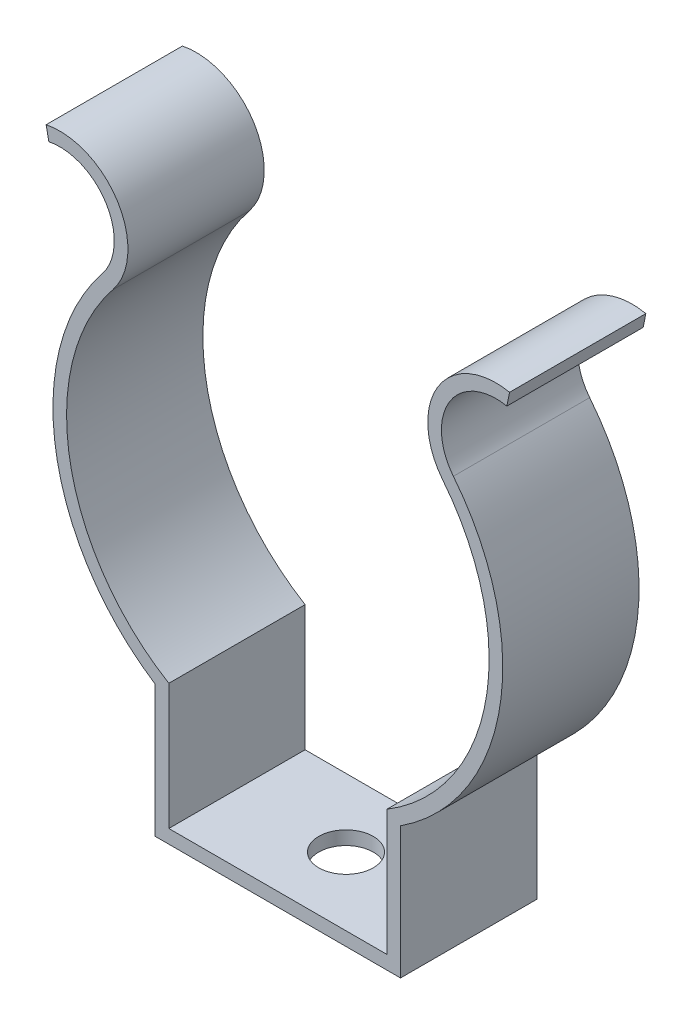
ISO-10303-21;
HEADER;
FILE_DESCRIPTION(('STEP AP214'),'2;1');
FILE_NAME('part.step','',(''),(''),'','','');
FILE_SCHEMA(('AUTOMOTIVE_DESIGN { 1 0 10303 214 1 1 1 1 }'));
ENDSEC;
DATA;
#1=APPLICATION_CONTEXT('core data for automotive mechanical design processes');
#2=APPLICATION_PROTOCOL_DEFINITION('international standard','automotive_design',2000,#1);
#3=PRODUCT_CONTEXT('',#1,'mechanical');
#4=PRODUCT('Part','Part','',(#3));
#5=PRODUCT_RELATED_PRODUCT_CATEGORY('part','',(#4));
#6=PRODUCT_DEFINITION_FORMATION('','',#4);
#7=PRODUCT_DEFINITION_CONTEXT('part definition',#1,'design');
#8=PRODUCT_DEFINITION('design','',#6,#7);
#9=PRODUCT_DEFINITION_SHAPE('','',#8);
#10=(LENGTH_UNIT() NAMED_UNIT(*) SI_UNIT(.MILLI.,.METRE.));
#11=(NAMED_UNIT(*) PLANE_ANGLE_UNIT() SI_UNIT($,.RADIAN.));
#12=(NAMED_UNIT(*) SI_UNIT($,.STERADIAN.) SOLID_ANGLE_UNIT());
#13=UNCERTAINTY_MEASURE_WITH_UNIT(LENGTH_MEASURE(1.E-05),#10,'distance_accuracy_value','');
#14=(GEOMETRIC_REPRESENTATION_CONTEXT(3) GLOBAL_UNCERTAINTY_ASSIGNED_CONTEXT((#13)) GLOBAL_UNIT_ASSIGNED_CONTEXT((#10,
#11,#12)) REPRESENTATION_CONTEXT('',''));
#15=CARTESIAN_POINT('',(0.,0.,0.));
#16=DIRECTION('',(0.,0.,1.));
#17=DIRECTION('',(1.,0.,0.));
#18=AXIS2_PLACEMENT_3D('',#15,#16,#17);
#19=CARTESIAN_POINT('',(-8.,-22.5,10.));
#20=DIRECTION('',(0.,-1.,0.));
#21=DIRECTION('',(1.,0.,0.));
#22=AXIS2_PLACEMENT_3D('',#19,#20,#21);
#23=PLANE('',#22);
#24=CARTESIAN_POINT('',(0.,-22.5,5.));
#25=DIRECTION('',(0.,1.,0.));
#26=DIRECTION('',(0.,0.,1.));
#27=AXIS2_PLACEMENT_3D('',#24,#25,#26);
#28=CIRCLE('',#27,2.);
#29=CARTESIAN_POINT('',(0.,-22.5,7.));
#30=VERTEX_POINT('',#29);
#31=EDGE_CURVE('E313',#30,#30,#28,.T.);
#32=ORIENTED_EDGE('',*,*,#31,.F.);
#33=EDGE_LOOP('',(#32));
#34=FACE_BOUND('',#33,.T.);
#35=DIRECTION('',(-1.,0.,0.));
#36=VECTOR('',#35,1.);
#37=CARTESIAN_POINT('',(-8.,-22.5,0.));
#38=LINE('',#37,#36);
#39=CARTESIAN_POINT('',(8.,-22.5,0.));
#40=VERTEX_POINT('',#39);
#41=CARTESIAN_POINT('',(-8.,-22.5,0.));
#42=VERTEX_POINT('',#41);
#43=EDGE_CURVE('E177',#40,#42,#38,.T.);
#44=ORIENTED_EDGE('',*,*,#43,.T.);
#45=DIRECTION('',(0.,0.,-1.));
#46=VECTOR('',#45,1.);
#47=CARTESIAN_POINT('',(-8.,-22.5,10.));
#48=LINE('',#47,#46);
#49=CARTESIAN_POINT('',(-8.,-22.5,10.));
#50=VERTEX_POINT('',#49);
#51=EDGE_CURVE('E11',#50,#42,#48,.T.);
#52=ORIENTED_EDGE('',*,*,#51,.F.);
#53=DIRECTION('',(-1.,0.,0.));
#54=VECTOR('',#53,1.);
#55=CARTESIAN_POINT('',(-8.,-22.5,10.));
#56=LINE('',#55,#54);
#57=CARTESIAN_POINT('',(8.,-22.5,10.));
#58=VERTEX_POINT('',#57);
#59=EDGE_CURVE('E207',#58,#50,#56,.T.);
#60=ORIENTED_EDGE('',*,*,#59,.F.);
#61=DIRECTION('',(0.,0.,-1.));
#62=VECTOR('',#61,1.);
#63=CARTESIAN_POINT('',(8.,-22.5,10.));
#64=LINE('',#63,#62);
#65=EDGE_CURVE('E173',#58,#40,#64,.T.);
#66=ORIENTED_EDGE('',*,*,#65,.T.);
#67=EDGE_LOOP('',(#44,#52,#60,#66));
#68=FACE_BOUND('',#67,.T.);
#69=ADVANCED_FACE('F32',(#34,#68),#23,.F.);
#70=CARTESIAN_POINT('',(-8.,-13.2759180473518,10.));
#71=DIRECTION('',(-1.,0.,0.));
#72=DIRECTION('',(0.,-1.,0.));
#73=AXIS2_PLACEMENT_3D('',#70,#71,#72);
#74=PLANE('',#73);
#75=DIRECTION('',(0.,1.,0.));
#76=VECTOR('',#75,1.);
#77=CARTESIAN_POINT('',(-8.,-13.2759180473518,0.));
#78=LINE('',#77,#76);
#79=CARTESIAN_POINT('',(-8.,-13.2759180473518,0.));
#80=VERTEX_POINT('',#79);
#81=EDGE_CURVE('E180',#42,#80,#78,.T.);
#82=ORIENTED_EDGE('',*,*,#81,.T.);
#83=DIRECTION('',(0.,0.,-1.));
#84=VECTOR('',#83,1.);
#85=CARTESIAN_POINT('',(-8.,-13.2759180473518,10.));
#86=LINE('',#85,#84);
#87=CARTESIAN_POINT('',(-8.,-13.2759180473518,10.));
#88=VERTEX_POINT('',#87);
#89=EDGE_CURVE('E41',#88,#80,#86,.T.);
#90=ORIENTED_EDGE('',*,*,#89,.F.);
#91=DIRECTION('',(0.,1.,0.));
#92=VECTOR('',#91,1.);
#93=CARTESIAN_POINT('',(-8.,-13.2759180473518,10.));
#94=LINE('',#93,#92);
#95=EDGE_CURVE('E116',#50,#88,#94,.T.);
#96=ORIENTED_EDGE('',*,*,#95,.F.);
#97=ORIENTED_EDGE('',*,*,#51,.T.);
#98=EDGE_LOOP('',(#82,#90,#96,#97));
#99=FACE_BOUND('',#98,.T.);
#100=ADVANCED_FACE('F306',(#99),#74,.F.);
#101=CARTESIAN_POINT('',(0.,0.,10.));
#102=DIRECTION('',(0.,0.,-1.));
#103=DIRECTION('',(-1.,0.,0.));
#104=AXIS2_PLACEMENT_3D('',#101,#102,#103);
#105=CYLINDRICAL_SURFACE('',#104,15.5);
#106=CARTESIAN_POINT('',(0.,0.,0.));
#107=DIRECTION('',(0.,0.,-1.));
#108=DIRECTION('',(-1.,0.,0.));
#109=AXIS2_PLACEMENT_3D('',#106,#107,#108);
#110=CIRCLE('',#109,15.5);
#111=CARTESIAN_POINT('',(-12.0975609756098,9.69015058920159,0.));
#112=VERTEX_POINT('',#111);
#113=EDGE_CURVE('E182',#80,#112,#110,.T.);
#114=ORIENTED_EDGE('',*,*,#113,.T.);
#115=DIRECTION('',(0.,0.,-1.));
#116=VECTOR('',#115,1.);
#117=CARTESIAN_POINT('',(-12.0975609756098,9.69015058920159,10.));
#118=LINE('',#117,#116);
#119=CARTESIAN_POINT('',(-12.0975609756098,9.69015058920159,10.));
#120=VERTEX_POINT('',#119);
#121=EDGE_CURVE('E238',#120,#112,#118,.T.);
#122=ORIENTED_EDGE('',*,*,#121,.F.);
#123=CARTESIAN_POINT('',(0.,0.,10.));
#124=DIRECTION('',(0.,0.,-1.));
#125=DIRECTION('',(-1.,0.,0.));
#126=AXIS2_PLACEMENT_3D('',#123,#124,#125);
#127=CIRCLE('',#126,15.5);
#128=EDGE_CURVE('E247',#88,#120,#127,.T.);
#129=ORIENTED_EDGE('',*,*,#128,.F.);
#130=ORIENTED_EDGE('',*,*,#89,.T.);
#131=EDGE_LOOP('',(#114,#122,#129,#130));
#132=FACE_BOUND('',#131,.T.);
#133=ADVANCED_FACE('F245',(#132),#105,.F.);
#134=CARTESIAN_POINT('',(-16.,12.8160056179763,10.));
#135=DIRECTION('',(0.,0.,-1.));
#136=DIRECTION('',(-1.,0.,0.));
#137=AXIS2_PLACEMENT_3D('',#134,#135,#136);
#138=CYLINDRICAL_SURFACE('',#137,5.);
#139=CARTESIAN_POINT('',(-16.,12.8160056179763,0.));
#140=DIRECTION('',(0.,0.,1.));
#141=DIRECTION('',(1.,0.,0.));
#142=AXIS2_PLACEMENT_3D('',#139,#140,#141);
#143=CIRCLE('',#142,5.);
#144=CARTESIAN_POINT('',(-17.,17.7149851035427,0.));
#145=VERTEX_POINT('',#144);
#146=EDGE_CURVE('E184',#112,#145,#143,.T.);
#147=ORIENTED_EDGE('',*,*,#146,.T.);
#148=DIRECTION('',(0.,0.,-1.));
#149=VECTOR('',#148,1.);
#150=CARTESIAN_POINT('',(-17.,17.7149851035427,10.));
#151=LINE('',#150,#149);
#152=CARTESIAN_POINT('',(-17.,17.7149851035427,10.));
#153=VERTEX_POINT('',#152);
#154=EDGE_CURVE('E235',#153,#145,#151,.T.);
#155=ORIENTED_EDGE('',*,*,#154,.F.);
#156=CARTESIAN_POINT('',(-16.,12.8160056179763,10.));
#157=DIRECTION('',(0.,0.,1.));
#158=DIRECTION('',(1.,0.,0.));
#159=AXIS2_PLACEMENT_3D('',#156,#157,#158);
#160=CIRCLE('',#159,5.);
#161=EDGE_CURVE('E265',#120,#153,#160,.T.);
#162=ORIENTED_EDGE('',*,*,#161,.F.);
#163=ORIENTED_EDGE('',*,*,#121,.T.);
#164=EDGE_LOOP('',(#147,#155,#162,#163));
#165=FACE_BOUND('',#164,.T.);
#166=ADVANCED_FACE('F256',(#165),#138,.T.);
#167=CARTESIAN_POINT('',(-17.,17.7149851035427,10.));
#168=DIRECTION('',(0.979795897113271,0.200000000000002,0.));
#169=DIRECTION('',(-0.200000000000002,0.979795897113271,0.));
#170=AXIS2_PLACEMENT_3D('',#167,#168,#169);
#171=PLANE('',#170);
#172=DIRECTION('',(0.200000000000002,-0.979795897113271,0.));
#173=VECTOR('',#172,1.);
#174=CARTESIAN_POINT('',(-17.,17.7149851035427,0.));
#175=LINE('',#174,#173);
#176=CARTESIAN_POINT('',(-16.8,16.7351892064294,0.));
#177=VERTEX_POINT('',#176);
#178=EDGE_CURVE('E186',#145,#177,#175,.T.);
#179=ORIENTED_EDGE('',*,*,#178,.T.);
#180=DIRECTION('',(0.,0.,-1.));
#181=VECTOR('',#180,1.);
#182=CARTESIAN_POINT('',(-16.8,16.7351892064294,10.));
#183=LINE('',#182,#181);
#184=CARTESIAN_POINT('',(-16.8,16.7351892064294,10.));
#185=VERTEX_POINT('',#184);
#186=EDGE_CURVE('E232',#185,#177,#183,.T.);
#187=ORIENTED_EDGE('',*,*,#186,.F.);
#188=DIRECTION('',(0.200000000000002,-0.979795897113271,0.));
#189=VECTOR('',#188,1.);
#190=CARTESIAN_POINT('',(-17.,17.7149851035427,10.));
#191=LINE('',#190,#189);
#192=EDGE_CURVE('E262',#153,#185,#191,.T.);
#193=ORIENTED_EDGE('',*,*,#192,.F.);
#194=ORIENTED_EDGE('',*,*,#154,.T.);
#195=EDGE_LOOP('',(#179,#187,#193,#194));
#196=FACE_BOUND('',#195,.T.);
#197=ADVANCED_FACE('F260',(#196),#171,.F.);
#198=CARTESIAN_POINT('',(-16.,12.8160056179763,10.));
#199=DIRECTION('',(0.,0.,-1.));
#200=DIRECTION('',(-1.,0.,0.));
#201=AXIS2_PLACEMENT_3D('',#198,#199,#200);
#202=CYLINDRICAL_SURFACE('',#201,4.);
#203=CARTESIAN_POINT('',(-16.,12.8160056179763,0.));
#204=DIRECTION('',(0.,0.,-1.));
#205=DIRECTION('',(1.,0.,0.));
#206=AXIS2_PLACEMENT_3D('',#203,#204,#205);
#207=CIRCLE('',#206,4.);
#208=CARTESIAN_POINT('',(-12.8780487804878,10.3153215949565,0.));
#209=VERTEX_POINT('',#208);
#210=EDGE_CURVE('E188',#177,#209,#207,.T.);
#211=ORIENTED_EDGE('',*,*,#210,.T.);
#212=DIRECTION('',(0.,0.,-1.));
#213=VECTOR('',#212,1.);
#214=CARTESIAN_POINT('',(-12.8780487804878,10.3153215949565,10.));
#215=LINE('',#214,#213);
#216=CARTESIAN_POINT('',(-12.8780487804878,10.3153215949565,10.));
#217=VERTEX_POINT('',#216);
#218=EDGE_CURVE('E229',#217,#209,#215,.T.);
#219=ORIENTED_EDGE('',*,*,#218,.F.);
#220=CARTESIAN_POINT('',(-16.,12.8160056179763,10.));
#221=DIRECTION('',(0.,0.,-1.));
#222=DIRECTION('',(1.,0.,0.));
#223=AXIS2_PLACEMENT_3D('',#220,#221,#222);
#224=CIRCLE('',#223,4.);
#225=EDGE_CURVE('E264',#185,#217,#224,.T.);
#226=ORIENTED_EDGE('',*,*,#225,.F.);
#227=ORIENTED_EDGE('',*,*,#186,.T.);
#228=EDGE_LOOP('',(#211,#219,#226,#227));
#229=FACE_BOUND('',#228,.T.);
#230=ADVANCED_FACE('F412',(#229),#202,.F.);
#231=CARTESIAN_POINT('',(0.,0.,10.));
#232=DIRECTION('',(0.,0.,-1.));
#233=DIRECTION('',(-1.,0.,0.));
#234=AXIS2_PLACEMENT_3D('',#231,#232,#233);
#235=CYLINDRICAL_SURFACE('',#234,16.5);
#236=CARTESIAN_POINT('',(0.,0.,0.));
#237=DIRECTION('',(0.,0.,1.));
#238=DIRECTION('',(-1.,0.,0.));
#239=AXIS2_PLACEMENT_3D('',#236,#237,#238);
#240=CIRCLE('',#239,16.5);
#241=CARTESIAN_POINT('',(-9.,-13.8293166859393,0.));
#242=VERTEX_POINT('',#241);
#243=EDGE_CURVE('E190',#209,#242,#240,.T.);
#244=ORIENTED_EDGE('',*,*,#243,.T.);
#245=DIRECTION('',(0.,0.,-1.));
#246=VECTOR('',#245,1.);
#247=CARTESIAN_POINT('',(-9.,-13.8293166859393,10.));
#248=LINE('',#247,#246);
#249=CARTESIAN_POINT('',(-9.,-13.8293166859393,10.));
#250=VERTEX_POINT('',#249);
#251=EDGE_CURVE('E226',#250,#242,#248,.T.);
#252=ORIENTED_EDGE('',*,*,#251,.F.);
#253=CARTESIAN_POINT('',(0.,0.,10.));
#254=DIRECTION('',(0.,0.,1.));
#255=DIRECTION('',(-1.,0.,0.));
#256=AXIS2_PLACEMENT_3D('',#253,#254,#255);
#257=CIRCLE('',#256,16.5);
#258=EDGE_CURVE('E267',#217,#250,#257,.T.);
#259=ORIENTED_EDGE('',*,*,#258,.F.);
#260=ORIENTED_EDGE('',*,*,#218,.T.);
#261=EDGE_LOOP('',(#244,#252,#259,#260));
#262=FACE_BOUND('',#261,.T.);
#263=ADVANCED_FACE('F402',(#262),#235,.T.);
#264=CARTESIAN_POINT('',(-9.,-13.8293166859393,10.));
#265=DIRECTION('',(1.,0.,0.));
#266=DIRECTION('',(0.,1.,0.));
#267=AXIS2_PLACEMENT_3D('',#264,#265,#266);
#268=PLANE('',#267);
#269=DIRECTION('',(0.,-1.,0.));
#270=VECTOR('',#269,1.);
#271=CARTESIAN_POINT('',(-9.,-13.8293166859393,0.));
#272=LINE('',#271,#270);
#273=CARTESIAN_POINT('',(-9.,-23.5,0.));
#274=VERTEX_POINT('',#273);
#275=EDGE_CURVE('E192',#242,#274,#272,.T.);
#276=ORIENTED_EDGE('',*,*,#275,.T.);
#277=DIRECTION('',(0.,0.,-1.));
#278=VECTOR('',#277,1.);
#279=CARTESIAN_POINT('',(-9.,-23.5,10.));
#280=LINE('',#279,#278);
#281=CARTESIAN_POINT('',(-9.,-23.5,10.));
#282=VERTEX_POINT('',#281);
#283=EDGE_CURVE('E223',#282,#274,#280,.T.);
#284=ORIENTED_EDGE('',*,*,#283,.F.);
#285=DIRECTION('',(0.,-1.,0.));
#286=VECTOR('',#285,1.);
#287=CARTESIAN_POINT('',(-9.,-13.8293166859393,10.));
#288=LINE('',#287,#286);
#289=EDGE_CURVE('E273',#250,#282,#288,.T.);
#290=ORIENTED_EDGE('',*,*,#289,.F.);
#291=ORIENTED_EDGE('',*,*,#251,.T.);
#292=EDGE_LOOP('',(#276,#284,#290,#291));
#293=FACE_BOUND('',#292,.T.);
#294=ADVANCED_FACE('F397',(#293),#268,.F.);
#295=CARTESIAN_POINT('',(-9.,-23.5,10.));
#296=DIRECTION('',(0.,1.,0.));
#297=DIRECTION('',(0.,0.,1.));
#298=AXIS2_PLACEMENT_3D('',#295,#296,#297);
#299=PLANE('',#298);
#300=CARTESIAN_POINT('',(0.,-23.5,5.));
#301=DIRECTION('',(0.,1.,0.));
#302=DIRECTION('',(0.,0.,1.));
#303=AXIS2_PLACEMENT_3D('',#300,#301,#302);
#304=CIRCLE('',#303,2.);
#305=CARTESIAN_POINT('',(0.,-23.5,7.));
#306=VERTEX_POINT('',#305);
#307=EDGE_CURVE('E35',#306,#306,#304,.T.);
#308=ORIENTED_EDGE('',*,*,#307,.T.);
#309=EDGE_LOOP('',(#308));
#310=FACE_BOUND('',#309,.T.);
#311=DIRECTION('',(1.,0.,0.));
#312=VECTOR('',#311,1.);
#313=CARTESIAN_POINT('',(-9.,-23.5,0.));
#314=LINE('',#313,#312);
#315=CARTESIAN_POINT('',(9.00000000000001,-23.5,0.));
#316=VERTEX_POINT('',#315);
#317=EDGE_CURVE('E194',#274,#316,#314,.T.);
#318=ORIENTED_EDGE('',*,*,#317,.T.);
#319=DIRECTION('',(0.,0.,-1.));
#320=VECTOR('',#319,1.);
#321=CARTESIAN_POINT('',(9.00000000000001,-23.5,10.));
#322=LINE('',#321,#320);
#323=CARTESIAN_POINT('',(9.00000000000001,-23.5,10.));
#324=VERTEX_POINT('',#323);
#325=EDGE_CURVE('E220',#324,#316,#322,.T.);
#326=ORIENTED_EDGE('',*,*,#325,.F.);
#327=DIRECTION('',(1.,0.,0.));
#328=VECTOR('',#327,1.);
#329=CARTESIAN_POINT('',(-9.,-23.5,10.));
#330=LINE('',#329,#328);
#331=EDGE_CURVE('E275',#282,#324,#330,.T.);
#332=ORIENTED_EDGE('',*,*,#331,.F.);
#333=ORIENTED_EDGE('',*,*,#283,.T.);
#334=EDGE_LOOP('',(#318,#326,#332,#333));
#335=FACE_BOUND('',#334,.T.);
#336=ADVANCED_FACE('F321',(#310,#335),#299,.F.);
#337=CARTESIAN_POINT('',(9.00000000000001,-23.5,10.));
#338=DIRECTION('',(-1.,0.,0.));
#339=DIRECTION('',(0.,0.,1.));
#340=AXIS2_PLACEMENT_3D('',#337,#338,#339);
#341=PLANE('',#340);
#342=DIRECTION('',(0.,1.,0.));
#343=VECTOR('',#342,1.);
#344=CARTESIAN_POINT('',(9.00000000000001,-23.5,0.));
#345=LINE('',#344,#343);
#346=CARTESIAN_POINT('',(9.00000000000001,-13.8293166859393,0.));
#347=VERTEX_POINT('',#346);
#348=EDGE_CURVE('E196',#316,#347,#345,.T.);
#349=ORIENTED_EDGE('',*,*,#348,.T.);
#350=DIRECTION('',(0.,0.,-1.));
#351=VECTOR('',#350,1.);
#352=CARTESIAN_POINT('',(9.00000000000001,-13.8293166859393,10.));
#353=LINE('',#352,#351);
#354=CARTESIAN_POINT('',(9.00000000000001,-13.8293166859393,10.));
#355=VERTEX_POINT('',#354);
#356=EDGE_CURVE('E217',#355,#347,#353,.T.);
#357=ORIENTED_EDGE('',*,*,#356,.F.);
#358=DIRECTION('',(0.,1.,0.));
#359=VECTOR('',#358,1.);
#360=CARTESIAN_POINT('',(9.00000000000001,-23.5,10.));
#361=LINE('',#360,#359);
#362=EDGE_CURVE('E277',#324,#355,#361,.T.);
#363=ORIENTED_EDGE('',*,*,#362,.F.);
#364=ORIENTED_EDGE('',*,*,#325,.T.);
#365=EDGE_LOOP('',(#349,#357,#363,#364));
#366=FACE_BOUND('',#365,.T.);
#367=ADVANCED_FACE('F380',(#366),#341,.F.);
#368=CARTESIAN_POINT('',(0.,0.,10.));
#369=DIRECTION('',(0.,0.,-1.));
#370=DIRECTION('',(-1.,0.,0.));
#371=AXIS2_PLACEMENT_3D('',#368,#369,#370);
#372=CYLINDRICAL_SURFACE('',#371,16.5);
#373=CARTESIAN_POINT('',(0.,0.,0.));
#374=DIRECTION('',(0.,0.,1.));
#375=DIRECTION('',(1.,0.,0.));
#376=AXIS2_PLACEMENT_3D('',#373,#374,#375);
#377=CIRCLE('',#376,16.5);
#378=CARTESIAN_POINT('',(12.8780487804878,10.3153215949565,0.));
#379=VERTEX_POINT('',#378);
#380=EDGE_CURVE('E198',#347,#379,#377,.T.);
#381=ORIENTED_EDGE('',*,*,#380,.T.);
#382=DIRECTION('',(0.,0.,-1.));
#383=VECTOR('',#382,1.);
#384=CARTESIAN_POINT('',(12.8780487804878,10.3153215949565,10.));
#385=LINE('',#384,#383);
#386=CARTESIAN_POINT('',(12.8780487804878,10.3153215949565,10.));
#387=VERTEX_POINT('',#386);
#388=EDGE_CURVE('E214',#387,#379,#385,.T.);
#389=ORIENTED_EDGE('',*,*,#388,.F.);
#390=CARTESIAN_POINT('',(0.,0.,10.));
#391=DIRECTION('',(0.,0.,1.));
#392=DIRECTION('',(1.,0.,0.));
#393=AXIS2_PLACEMENT_3D('',#390,#391,#392);
#394=CIRCLE('',#393,16.5);
#395=EDGE_CURVE('E279',#355,#387,#394,.T.);
#396=ORIENTED_EDGE('',*,*,#395,.F.);
#397=ORIENTED_EDGE('',*,*,#356,.T.);
#398=EDGE_LOOP('',(#381,#389,#396,#397));
#399=FACE_BOUND('',#398,.T.);
#400=ADVANCED_FACE('F371',(#399),#372,.T.);
#401=CARTESIAN_POINT('',(16.,12.8160056179763,10.));
#402=DIRECTION('',(0.,0.,-1.));
#403=DIRECTION('',(-1.,0.,0.));
#404=AXIS2_PLACEMENT_3D('',#401,#402,#403);
#405=CYLINDRICAL_SURFACE('',#404,4.);
#406=CARTESIAN_POINT('',(16.,12.8160056179763,0.));
#407=DIRECTION('',(0.,0.,-1.));
#408=DIRECTION('',(-1.,0.,0.));
#409=AXIS2_PLACEMENT_3D('',#406,#407,#408);
#410=CIRCLE('',#409,4.);
#411=CARTESIAN_POINT('',(16.8,16.7351892064294,0.));
#412=VERTEX_POINT('',#411);
#413=EDGE_CURVE('E200',#379,#412,#410,.T.);
#414=ORIENTED_EDGE('',*,*,#413,.T.);
#415=DIRECTION('',(0.,0.,-1.));
#416=VECTOR('',#415,1.);
#417=CARTESIAN_POINT('',(16.8,16.7351892064294,10.));
#418=LINE('',#417,#416);
#419=CARTESIAN_POINT('',(16.8,16.7351892064294,10.));
#420=VERTEX_POINT('',#419);
#421=EDGE_CURVE('E211',#420,#412,#418,.T.);
#422=ORIENTED_EDGE('',*,*,#421,.F.);
#423=CARTESIAN_POINT('',(16.,12.8160056179763,10.));
#424=DIRECTION('',(0.,0.,-1.));
#425=DIRECTION('',(-1.,0.,0.));
#426=AXIS2_PLACEMENT_3D('',#423,#424,#425);
#427=CIRCLE('',#426,4.);
#428=EDGE_CURVE('E281',#387,#420,#427,.T.);
#429=ORIENTED_EDGE('',*,*,#428,.F.);
#430=ORIENTED_EDGE('',*,*,#388,.T.);
#431=EDGE_LOOP('',(#414,#422,#429,#430));
#432=FACE_BOUND('',#431,.T.);
#433=ADVANCED_FACE('F287',(#432),#405,.F.);
#434=CARTESIAN_POINT('',(17.,17.7149851035427,10.));
#435=DIRECTION('',(-0.979795897113272,0.199999999999999,0.));
#436=DIRECTION('',(-0.199999999999999,-0.979795897113272,0.));
#437=AXIS2_PLACEMENT_3D('',#434,#435,#436);
#438=PLANE('',#437);
#439=DIRECTION('',(0.199999999999999,0.979795897113272,0.));
#440=VECTOR('',#439,1.);
#441=CARTESIAN_POINT('',(17.,17.7149851035427,0.));
#442=LINE('',#441,#440);
#443=CARTESIAN_POINT('',(17.,17.7149851035427,0.));
#444=VERTEX_POINT('',#443);
#445=EDGE_CURVE('E202',#412,#444,#442,.T.);
#446=ORIENTED_EDGE('',*,*,#445,.T.);
#447=DIRECTION('',(0.,0.,-1.));
#448=VECTOR('',#447,1.);
#449=CARTESIAN_POINT('',(17.,17.7149851035427,10.));
#450=LINE('',#449,#448);
#451=CARTESIAN_POINT('',(17.,17.7149851035427,10.));
#452=VERTEX_POINT('',#451);
#453=EDGE_CURVE('E168',#452,#444,#450,.T.);
#454=ORIENTED_EDGE('',*,*,#453,.F.);
#455=DIRECTION('',(0.199999999999999,0.979795897113272,0.));
#456=VECTOR('',#455,1.);
#457=CARTESIAN_POINT('',(17.,17.7149851035427,10.));
#458=LINE('',#457,#456);
#459=EDGE_CURVE('E159',#420,#452,#458,.T.);
#460=ORIENTED_EDGE('',*,*,#459,.F.);
#461=ORIENTED_EDGE('',*,*,#421,.T.);
#462=EDGE_LOOP('',(#446,#454,#460,#461));
#463=FACE_BOUND('',#462,.T.);
#464=ADVANCED_FACE('F291',(#463),#438,.F.);
#465=CARTESIAN_POINT('',(16.,12.8160056179763,10.));
#466=DIRECTION('',(0.,0.,-1.));
#467=DIRECTION('',(-1.,0.,0.));
#468=AXIS2_PLACEMENT_3D('',#465,#466,#467);
#469=CYLINDRICAL_SURFACE('',#468,5.);
#470=CARTESIAN_POINT('',(16.,12.8160056179763,0.));
#471=DIRECTION('',(0.,0.,1.));
#472=DIRECTION('',(-1.,0.,0.));
#473=AXIS2_PLACEMENT_3D('',#470,#471,#472);
#474=CIRCLE('',#473,5.);
#475=CARTESIAN_POINT('',(12.0975609756097,9.69015058920159,0.));
#476=VERTEX_POINT('',#475);
#477=EDGE_CURVE('E167',#444,#476,#474,.T.);
#478=ORIENTED_EDGE('',*,*,#477,.T.);
#479=DIRECTION('',(0.,0.,-1.));
#480=VECTOR('',#479,1.);
#481=CARTESIAN_POINT('',(12.0975609756097,9.69015058920159,10.));
#482=LINE('',#481,#480);
#483=CARTESIAN_POINT('',(12.0975609756097,9.69015058920159,10.));
#484=VERTEX_POINT('',#483);
#485=EDGE_CURVE('E164',#484,#476,#482,.T.);
#486=ORIENTED_EDGE('',*,*,#485,.F.);
#487=CARTESIAN_POINT('',(16.,12.8160056179763,10.));
#488=DIRECTION('',(0.,0.,1.));
#489=DIRECTION('',(-1.,0.,0.));
#490=AXIS2_PLACEMENT_3D('',#487,#488,#489);
#491=CIRCLE('',#490,5.);
#492=EDGE_CURVE('E153',#452,#484,#491,.T.);
#493=ORIENTED_EDGE('',*,*,#492,.F.);
#494=ORIENTED_EDGE('',*,*,#453,.T.);
#495=EDGE_LOOP('',(#478,#486,#493,#494));
#496=FACE_BOUND('',#495,.T.);
#497=ADVANCED_FACE('F165',(#496),#469,.T.);
#498=CARTESIAN_POINT('',(0.,0.,10.));
#499=DIRECTION('',(0.,0.,-1.));
#500=DIRECTION('',(-1.,0.,0.));
#501=AXIS2_PLACEMENT_3D('',#498,#499,#500);
#502=CYLINDRICAL_SURFACE('',#501,15.5);
#503=CARTESIAN_POINT('',(0.,0.,0.));
#504=DIRECTION('',(0.,0.,-1.));
#505=DIRECTION('',(1.,0.,0.));
#506=AXIS2_PLACEMENT_3D('',#503,#504,#505);
#507=CIRCLE('',#506,15.5);
#508=CARTESIAN_POINT('',(8.,-13.2759180473518,0.));
#509=VERTEX_POINT('',#508);
#510=EDGE_CURVE('E102',#476,#509,#507,.T.);
#511=ORIENTED_EDGE('',*,*,#510,.T.);
#512=DIRECTION('',(0.,0.,-1.));
#513=VECTOR('',#512,1.);
#514=CARTESIAN_POINT('',(8.,-13.2759180473518,10.));
#515=LINE('',#514,#513);
#516=CARTESIAN_POINT('',(8.,-13.2759180473518,10.));
#517=VERTEX_POINT('',#516);
#518=EDGE_CURVE('E169',#517,#509,#515,.T.);
#519=ORIENTED_EDGE('',*,*,#518,.F.);
#520=CARTESIAN_POINT('',(0.,0.,10.));
#521=DIRECTION('',(0.,0.,-1.));
#522=DIRECTION('',(1.,0.,0.));
#523=AXIS2_PLACEMENT_3D('',#520,#521,#522);
#524=CIRCLE('',#523,15.5);
#525=EDGE_CURVE('E157',#484,#517,#524,.T.);
#526=ORIENTED_EDGE('',*,*,#525,.F.);
#527=ORIENTED_EDGE('',*,*,#485,.T.);
#528=EDGE_LOOP('',(#511,#519,#526,#527));
#529=FACE_BOUND('',#528,.T.);
#530=ADVANCED_FACE('F171',(#529),#502,.F.);
#531=CARTESIAN_POINT('',(8.,-22.5,10.));
#532=DIRECTION('',(1.,0.,0.));
#533=DIRECTION('',(0.,1.,0.));
#534=AXIS2_PLACEMENT_3D('',#531,#532,#533);
#535=PLANE('',#534);
#536=DIRECTION('',(0.,-1.,0.));
#537=VECTOR('',#536,1.);
#538=CARTESIAN_POINT('',(8.,-22.5,0.));
#539=LINE('',#538,#537);
#540=EDGE_CURVE('E108',#509,#40,#539,.T.);
#541=ORIENTED_EDGE('',*,*,#540,.T.);
#542=ORIENTED_EDGE('',*,*,#65,.F.);
#543=DIRECTION('',(0.,-1.,0.));
#544=VECTOR('',#543,1.);
#545=CARTESIAN_POINT('',(8.,-22.5,10.));
#546=LINE('',#545,#544);
#547=EDGE_CURVE('E49',#517,#58,#546,.T.);
#548=ORIENTED_EDGE('',*,*,#547,.F.);
#549=ORIENTED_EDGE('',*,*,#518,.T.);
#550=EDGE_LOOP('',(#541,#542,#548,#549));
#551=FACE_BOUND('',#550,.T.);
#552=ADVANCED_FACE('F295',(#551),#535,.F.);
#553=CARTESIAN_POINT('',(0.,0.,10.));
#554=DIRECTION('',(0.,0.,1.));
#555=DIRECTION('',(1.,0.,0.));
#556=AXIS2_PLACEMENT_3D('',#553,#554,#555);
#557=PLANE('',#556);
#558=ORIENTED_EDGE('',*,*,#59,.T.);
#559=ORIENTED_EDGE('',*,*,#95,.T.);
#560=ORIENTED_EDGE('',*,*,#128,.T.);
#561=ORIENTED_EDGE('',*,*,#161,.T.);
#562=ORIENTED_EDGE('',*,*,#192,.T.);
#563=ORIENTED_EDGE('',*,*,#225,.T.);
#564=ORIENTED_EDGE('',*,*,#258,.T.);
#565=ORIENTED_EDGE('',*,*,#289,.T.);
#566=ORIENTED_EDGE('',*,*,#331,.T.);
#567=ORIENTED_EDGE('',*,*,#362,.T.);
#568=ORIENTED_EDGE('',*,*,#395,.T.);
#569=ORIENTED_EDGE('',*,*,#428,.T.);
#570=ORIENTED_EDGE('',*,*,#459,.T.);
#571=ORIENTED_EDGE('',*,*,#492,.T.);
#572=ORIENTED_EDGE('',*,*,#525,.T.);
#573=ORIENTED_EDGE('',*,*,#547,.T.);
#574=EDGE_LOOP('',(#558,#559,#560,#561,#562,#563,#564,#565,#566,#567,#568,#569,#570,#571,#572,#573));
#575=FACE_BOUND('',#574,.T.);
#576=ADVANCED_FACE('F155',(#575),#557,.T.);
#577=CARTESIAN_POINT('',(0.,0.,0.));
#578=DIRECTION('',(0.,0.,1.));
#579=DIRECTION('',(1.,0.,0.));
#580=AXIS2_PLACEMENT_3D('',#577,#578,#579);
#581=PLANE('',#580);
#582=ORIENTED_EDGE('',*,*,#43,.F.);
#583=ORIENTED_EDGE('',*,*,#540,.F.);
#584=ORIENTED_EDGE('',*,*,#510,.F.);
#585=ORIENTED_EDGE('',*,*,#477,.F.);
#586=ORIENTED_EDGE('',*,*,#445,.F.);
#587=ORIENTED_EDGE('',*,*,#413,.F.);
#588=ORIENTED_EDGE('',*,*,#380,.F.);
#589=ORIENTED_EDGE('',*,*,#348,.F.);
#590=ORIENTED_EDGE('',*,*,#317,.F.);
#591=ORIENTED_EDGE('',*,*,#275,.F.);
#592=ORIENTED_EDGE('',*,*,#243,.F.);
#593=ORIENTED_EDGE('',*,*,#210,.F.);
#594=ORIENTED_EDGE('',*,*,#178,.F.);
#595=ORIENTED_EDGE('',*,*,#146,.F.);
#596=ORIENTED_EDGE('',*,*,#113,.F.);
#597=ORIENTED_EDGE('',*,*,#81,.F.);
#598=EDGE_LOOP('',(#582,#583,#584,#585,#586,#587,#588,#589,#590,#591,#592,#593,#594,#595,#596,#597));
#599=FACE_BOUND('',#598,.T.);
#600=ADVANCED_FACE('F251',(#599),#581,.F.);
#601=CARTESIAN_POINT('',(0.,-32.5,5.));
#602=DIRECTION('',(0.,1.,0.));
#603=DIRECTION('',(0.,0.,1.));
#604=AXIS2_PLACEMENT_3D('',#601,#602,#603);
#605=CYLINDRICAL_SURFACE('',#604,2.);
#606=ORIENTED_EDGE('',*,*,#31,.T.);
#607=EDGE_LOOP('',(#606));
#608=FACE_BOUND('',#607,.T.);
#609=ORIENTED_EDGE('',*,*,#307,.F.);
#610=EDGE_LOOP('',(#609));
#611=FACE_BOUND('',#610,.T.);
#612=ADVANCED_FACE('F324',(#608,#611),#605,.F.);
#613=CLOSED_SHELL('',(#69,#100,#133,#166,#197,#230,#263,#294,#336,#367,#400,#433,#464,#497,#530,
#552,#576,#600,#612));
#614=MANIFOLD_SOLID_BREP('B2',#613);
#615=ADVANCED_BREP_SHAPE_REPRESENTATION('',(#18,#614),#14);
#616=SHAPE_DEFINITION_REPRESENTATION(#9,#615);
ENDSEC;
END-ISO-10303-21;
